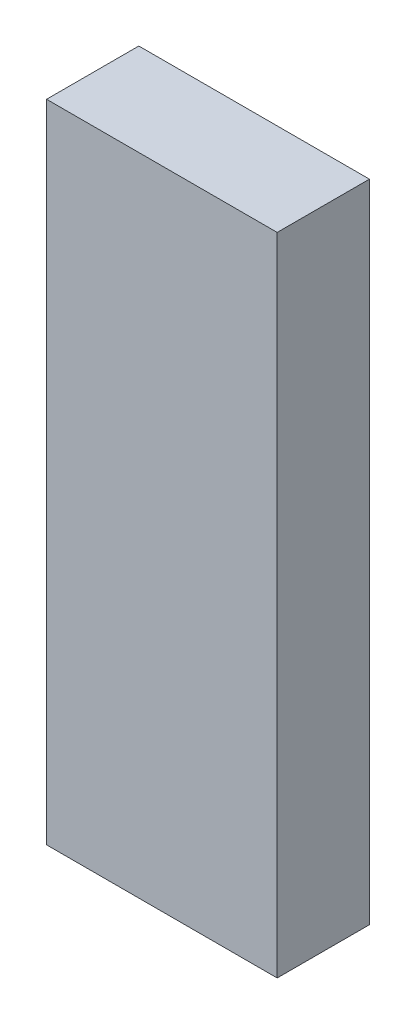
ISO-10303-21;
HEADER;
FILE_DESCRIPTION(('STEP AP214'),'2;1');
FILE_NAME('part.step','',(''),(''),'','','');
FILE_SCHEMA(('AUTOMOTIVE_DESIGN { 1 0 10303 214 1 1 1 1 }'));
ENDSEC;
DATA;
#1=APPLICATION_CONTEXT('core data for automotive mechanical design processes');
#2=APPLICATION_PROTOCOL_DEFINITION('international standard','automotive_design',2000,#1);
#3=PRODUCT_CONTEXT('',#1,'mechanical');
#4=PRODUCT('Part','Part','',(#3));
#5=PRODUCT_RELATED_PRODUCT_CATEGORY('part','',(#4));
#6=PRODUCT_DEFINITION_FORMATION('','',#4);
#7=PRODUCT_DEFINITION_CONTEXT('part definition',#1,'design');
#8=PRODUCT_DEFINITION('design','',#6,#7);
#9=PRODUCT_DEFINITION_SHAPE('','',#8);
#10=(LENGTH_UNIT() NAMED_UNIT(*) SI_UNIT(.MILLI.,.METRE.));
#11=(NAMED_UNIT(*) PLANE_ANGLE_UNIT() SI_UNIT($,.RADIAN.));
#12=(NAMED_UNIT(*) SI_UNIT($,.STERADIAN.) SOLID_ANGLE_UNIT());
#13=UNCERTAINTY_MEASURE_WITH_UNIT(LENGTH_MEASURE(1.E-05),#10,'distance_accuracy_value','');
#14=(GEOMETRIC_REPRESENTATION_CONTEXT(3) GLOBAL_UNCERTAINTY_ASSIGNED_CONTEXT((#13)) GLOBAL_UNIT_ASSIGNED_CONTEXT((#10,
#11,#12)) REPRESENTATION_CONTEXT('',''));
#15=CARTESIAN_POINT('',(0.,0.,0.));
#16=DIRECTION('',(0.,0.,1.));
#17=DIRECTION('',(1.,0.,0.));
#18=AXIS2_PLACEMENT_3D('',#15,#16,#17);
#19=CARTESIAN_POINT('',(3900.,580.,20.));
#20=DIRECTION('',(0.,1.,0.));
#21=DIRECTION('',(0.,0.,1.));
#22=AXIS2_PLACEMENT_3D('',#19,#20,#21);
#23=PLANE('',#22);
#24=DIRECTION('',(1.,0.,0.));
#25=VECTOR('',#24,1.);
#26=CARTESIAN_POINT('',(3900.,580.,0.));
#27=LINE('',#26,#25);
#28=CARTESIAN_POINT('',(3850.,580.,0.));
#29=VERTEX_POINT('',#28);
#30=CARTESIAN_POINT('',(3900.,580.,0.));
#31=VERTEX_POINT('',#30);
#32=EDGE_CURVE('E105',#29,#31,#27,.T.);
#33=ORIENTED_EDGE('',*,*,#32,.T.);
#34=DIRECTION('',(0.,0.,-1.));
#35=VECTOR('',#34,1.);
#36=CARTESIAN_POINT('',(3900.,580.,20.));
#37=LINE('',#36,#35);
#38=CARTESIAN_POINT('',(3900.,580.,20.));
#39=VERTEX_POINT('',#38);
#40=EDGE_CURVE('E11',#39,#31,#37,.T.);
#41=ORIENTED_EDGE('',*,*,#40,.F.);
#42=DIRECTION('',(1.,0.,0.));
#43=VECTOR('',#42,1.);
#44=CARTESIAN_POINT('',(3900.,580.,20.));
#45=LINE('',#44,#43);
#46=CARTESIAN_POINT('',(3850.,580.,20.));
#47=VERTEX_POINT('',#46);
#48=EDGE_CURVE('E89',#47,#39,#45,.T.);
#49=ORIENTED_EDGE('',*,*,#48,.F.);
#50=DIRECTION('',(0.,0.,-1.));
#51=VECTOR('',#50,1.);
#52=CARTESIAN_POINT('',(3850.,580.,20.));
#53=LINE('',#52,#51);
#54=EDGE_CURVE('E97',#47,#29,#53,.T.);
#55=ORIENTED_EDGE('',*,*,#54,.T.);
#56=EDGE_LOOP('',(#33,#41,#49,#55));
#57=FACE_BOUND('',#56,.T.);
#58=ADVANCED_FACE('F39',(#57),#23,.F.);
#59=CARTESIAN_POINT('',(3900.,720.,20.));
#60=DIRECTION('',(-1.,0.,0.));
#61=DIRECTION('',(0.,0.,1.));
#62=AXIS2_PLACEMENT_3D('',#59,#60,#61);
#63=PLANE('',#62);
#64=DIRECTION('',(0.,1.,0.));
#65=VECTOR('',#64,1.);
#66=CARTESIAN_POINT('',(3900.,720.,0.));
#67=LINE('',#66,#65);
#68=CARTESIAN_POINT('',(3900.,720.,0.));
#69=VERTEX_POINT('',#68);
#70=EDGE_CURVE('E92',#31,#69,#67,.T.);
#71=ORIENTED_EDGE('',*,*,#70,.T.);
#72=DIRECTION('',(0.,0.,-1.));
#73=VECTOR('',#72,1.);
#74=CARTESIAN_POINT('',(3900.,720.,20.));
#75=LINE('',#74,#73);
#76=CARTESIAN_POINT('',(3900.,720.,20.));
#77=VERTEX_POINT('',#76);
#78=EDGE_CURVE('E50',#77,#69,#75,.T.);
#79=ORIENTED_EDGE('',*,*,#78,.F.);
#80=DIRECTION('',(0.,1.,0.));
#81=VECTOR('',#80,1.);
#82=CARTESIAN_POINT('',(3900.,720.,20.));
#83=LINE('',#82,#81);
#84=EDGE_CURVE('E82',#39,#77,#83,.T.);
#85=ORIENTED_EDGE('',*,*,#84,.F.);
#86=ORIENTED_EDGE('',*,*,#40,.T.);
#87=EDGE_LOOP('',(#71,#79,#85,#86));
#88=FACE_BOUND('',#87,.T.);
#89=ADVANCED_FACE('F93',(#88),#63,.F.);
#90=CARTESIAN_POINT('',(3850.,720.,20.));
#91=DIRECTION('',(0.,-1.,0.));
#92=DIRECTION('',(0.,0.,-1.));
#93=AXIS2_PLACEMENT_3D('',#90,#91,#92);
#94=PLANE('',#93);
#95=DIRECTION('',(-1.,0.,0.));
#96=VECTOR('',#95,1.);
#97=CARTESIAN_POINT('',(3850.,720.,0.));
#98=LINE('',#97,#96);
#99=CARTESIAN_POINT('',(3850.,720.,0.));
#100=VERTEX_POINT('',#99);
#101=EDGE_CURVE('E72',#69,#100,#98,.T.);
#102=ORIENTED_EDGE('',*,*,#101,.T.);
#103=DIRECTION('',(0.,0.,-1.));
#104=VECTOR('',#103,1.);
#105=CARTESIAN_POINT('',(3850.,720.,20.));
#106=LINE('',#105,#104);
#107=CARTESIAN_POINT('',(3850.,720.,20.));
#108=VERTEX_POINT('',#107);
#109=EDGE_CURVE('E94',#108,#100,#106,.T.);
#110=ORIENTED_EDGE('',*,*,#109,.F.);
#111=DIRECTION('',(-1.,0.,0.));
#112=VECTOR('',#111,1.);
#113=CARTESIAN_POINT('',(3850.,720.,20.));
#114=LINE('',#113,#112);
#115=EDGE_CURVE('E88',#77,#108,#114,.T.);
#116=ORIENTED_EDGE('',*,*,#115,.F.);
#117=ORIENTED_EDGE('',*,*,#78,.T.);
#118=EDGE_LOOP('',(#102,#110,#116,#117));
#119=FACE_BOUND('',#118,.T.);
#120=ADVANCED_FACE('F96',(#119),#94,.F.);
#121=CARTESIAN_POINT('',(3850.,580.,20.));
#122=DIRECTION('',(1.,0.,0.));
#123=DIRECTION('',(0.,0.,-1.));
#124=AXIS2_PLACEMENT_3D('',#121,#122,#123);
#125=PLANE('',#124);
#126=DIRECTION('',(0.,-1.,0.));
#127=VECTOR('',#126,1.);
#128=CARTESIAN_POINT('',(3850.,580.,0.));
#129=LINE('',#128,#127);
#130=EDGE_CURVE('E76',#100,#29,#129,.T.);
#131=ORIENTED_EDGE('',*,*,#130,.T.);
#132=ORIENTED_EDGE('',*,*,#54,.F.);
#133=DIRECTION('',(0.,-1.,0.));
#134=VECTOR('',#133,1.);
#135=CARTESIAN_POINT('',(3850.,580.,20.));
#136=LINE('',#135,#134);
#137=EDGE_CURVE('E54',#108,#47,#136,.T.);
#138=ORIENTED_EDGE('',*,*,#137,.F.);
#139=ORIENTED_EDGE('',*,*,#109,.T.);
#140=EDGE_LOOP('',(#131,#132,#138,#139));
#141=FACE_BOUND('',#140,.T.);
#142=ADVANCED_FACE('F108',(#141),#125,.F.);
#143=CARTESIAN_POINT('',(0.,0.,20.));
#144=DIRECTION('',(0.,0.,-1.));
#145=DIRECTION('',(-1.,0.,0.));
#146=AXIS2_PLACEMENT_3D('',#143,#144,#145);
#147=PLANE('',#146);
#148=ORIENTED_EDGE('',*,*,#48,.T.);
#149=ORIENTED_EDGE('',*,*,#84,.T.);
#150=ORIENTED_EDGE('',*,*,#115,.T.);
#151=ORIENTED_EDGE('',*,*,#137,.T.);
#152=EDGE_LOOP('',(#148,#149,#150,#151));
#153=FACE_BOUND('',#152,.T.);
#154=ADVANCED_FACE('F86',(#153),#147,.F.);
#155=CARTESIAN_POINT('',(0.,0.,0.));
#156=DIRECTION('',(0.,0.,-1.));
#157=DIRECTION('',(-1.,0.,0.));
#158=AXIS2_PLACEMENT_3D('',#155,#156,#157);
#159=PLANE('',#158);
#160=ORIENTED_EDGE('',*,*,#32,.F.);
#161=ORIENTED_EDGE('',*,*,#130,.F.);
#162=ORIENTED_EDGE('',*,*,#101,.F.);
#163=ORIENTED_EDGE('',*,*,#70,.F.);
#164=EDGE_LOOP('',(#160,#161,#162,#163));
#165=FACE_BOUND('',#164,.T.);
#166=ADVANCED_FACE('F115',(#165),#159,.T.);
#167=CLOSED_SHELL('',(#58,#89,#120,#142,#154,#166));
#168=MANIFOLD_SOLID_BREP('B2',#167);
#169=ADVANCED_BREP_SHAPE_REPRESENTATION('',(#18,#168),#14);
#170=SHAPE_DEFINITION_REPRESENTATION(#9,#169);
ENDSEC;
END-ISO-10303-21;
